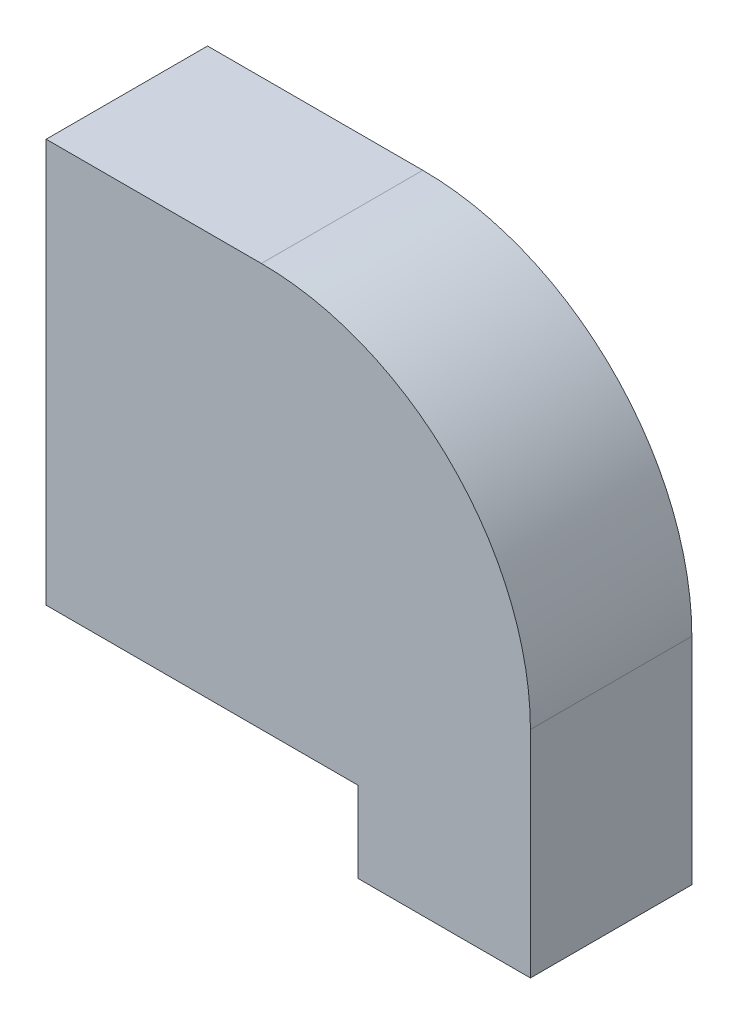
ISO-10303-21;
HEADER;
FILE_DESCRIPTION(('STEP AP214'),'2;1');
FILE_NAME('part.step','',(''),(''),'','','');
FILE_SCHEMA(('AUTOMOTIVE_DESIGN { 1 0 10303 214 1 1 1 1 }'));
ENDSEC;
DATA;
#1=APPLICATION_CONTEXT('core data for automotive mechanical design processes');
#2=APPLICATION_PROTOCOL_DEFINITION('international standard','automotive_design',2000,#1);
#3=PRODUCT_CONTEXT('',#1,'mechanical');
#4=PRODUCT('Part','Part','',(#3));
#5=PRODUCT_RELATED_PRODUCT_CATEGORY('part','',(#4));
#6=PRODUCT_DEFINITION_FORMATION('','',#4);
#7=PRODUCT_DEFINITION_CONTEXT('part definition',#1,'design');
#8=PRODUCT_DEFINITION('design','',#6,#7);
#9=PRODUCT_DEFINITION_SHAPE('','',#8);
#10=(LENGTH_UNIT() NAMED_UNIT(*) SI_UNIT(.MILLI.,.METRE.));
#11=(NAMED_UNIT(*) PLANE_ANGLE_UNIT() SI_UNIT($,.RADIAN.));
#12=(NAMED_UNIT(*) SI_UNIT($,.STERADIAN.) SOLID_ANGLE_UNIT());
#13=UNCERTAINTY_MEASURE_WITH_UNIT(LENGTH_MEASURE(1.E-05),#10,'distance_accuracy_value','');
#14=(GEOMETRIC_REPRESENTATION_CONTEXT(3) GLOBAL_UNCERTAINTY_ASSIGNED_CONTEXT((#13)) GLOBAL_UNIT_ASSIGNED_CONTEXT((#10,
#11,#12)) REPRESENTATION_CONTEXT('',''));
#15=CARTESIAN_POINT('',(0.,0.,0.));
#16=DIRECTION('',(0.,0.,1.));
#17=DIRECTION('',(1.,0.,0.));
#18=AXIS2_PLACEMENT_3D('',#15,#16,#17);
#19=CARTESIAN_POINT('',(25.4,25.4,19.05));
#20=DIRECTION('',(0.,0.,-1.));
#21=DIRECTION('',(-1.,0.,0.));
#22=AXIS2_PLACEMENT_3D('',#19,#20,#21);
#23=CYLINDRICAL_SURFACE('',#22,31.75);
#24=CARTESIAN_POINT('',(25.4,25.4,0.));
#25=DIRECTION('',(0.,0.,1.));
#26=DIRECTION('',(1.,0.,0.));
#27=AXIS2_PLACEMENT_3D('',#24,#25,#26);
#28=CIRCLE('',#27,31.75);
#29=CARTESIAN_POINT('',(25.4,57.15,0.));
#30=VERTEX_POINT('',#29);
#31=CARTESIAN_POINT('',(57.15,25.4,0.));
#32=VERTEX_POINT('',#31);
#33=EDGE_CURVE('E124',#30,#32,#28,.F.);
#34=ORIENTED_EDGE('',*,*,#33,.F.);
#35=DIRECTION('',(0.,0.,-1.));
#36=VECTOR('',#35,1.);
#37=CARTESIAN_POINT('',(25.4,57.15,19.05));
#38=LINE('',#37,#36);
#39=CARTESIAN_POINT('',(25.4,57.15,19.05));
#40=VERTEX_POINT('',#39);
#41=EDGE_CURVE('E11',#40,#30,#38,.T.);
#42=ORIENTED_EDGE('',*,*,#41,.F.);
#43=CARTESIAN_POINT('',(25.4,25.4,19.05));
#44=DIRECTION('',(0.,0.,1.));
#45=DIRECTION('',(1.,0.,0.));
#46=AXIS2_PLACEMENT_3D('',#43,#44,#45);
#47=CIRCLE('',#46,31.75);
#48=CARTESIAN_POINT('',(57.15,25.4,19.05));
#49=VERTEX_POINT('',#48);
#50=EDGE_CURVE('E139',#40,#49,#47,.F.);
#51=ORIENTED_EDGE('',*,*,#50,.T.);
#52=DIRECTION('',(0.,0.,-1.));
#53=VECTOR('',#52,1.);
#54=CARTESIAN_POINT('',(57.15,25.4,19.05));
#55=LINE('',#54,#53);
#56=EDGE_CURVE('E85',#49,#32,#55,.T.);
#57=ORIENTED_EDGE('',*,*,#56,.T.);
#58=EDGE_LOOP('',(#34,#42,#51,#57));
#59=FACE_BOUND('',#58,.T.);
#60=ADVANCED_FACE('F37',(#59),#23,.T.);
#61=CARTESIAN_POINT('',(0.,57.15,19.05));
#62=DIRECTION('',(0.,1.,0.));
#63=DIRECTION('',(-1.,0.,0.));
#64=AXIS2_PLACEMENT_3D('',#61,#62,#63);
#65=PLANE('',#64);
#66=DIRECTION('',(1.,0.,0.));
#67=VECTOR('',#66,1.);
#68=CARTESIAN_POINT('',(0.,57.15,0.));
#69=LINE('',#68,#67);
#70=CARTESIAN_POINT('',(0.,57.15,0.));
#71=VERTEX_POINT('',#70);
#72=EDGE_CURVE('E127',#71,#30,#69,.T.);
#73=ORIENTED_EDGE('',*,*,#72,.F.);
#74=DIRECTION('',(0.,0.,-1.));
#75=VECTOR('',#74,1.);
#76=CARTESIAN_POINT('',(0.,57.15,19.05));
#77=LINE('',#76,#75);
#78=CARTESIAN_POINT('',(0.,57.15,19.05));
#79=VERTEX_POINT('',#78);
#80=EDGE_CURVE('E45',#79,#71,#77,.T.);
#81=ORIENTED_EDGE('',*,*,#80,.F.);
#82=DIRECTION('',(1.,0.,0.));
#83=VECTOR('',#82,1.);
#84=CARTESIAN_POINT('',(0.,57.15,19.05));
#85=LINE('',#84,#83);
#86=EDGE_CURVE('E159',#79,#40,#85,.T.);
#87=ORIENTED_EDGE('',*,*,#86,.T.);
#88=ORIENTED_EDGE('',*,*,#41,.T.);
#89=EDGE_LOOP('',(#73,#81,#87,#88));
#90=FACE_BOUND('',#89,.T.);
#91=ADVANCED_FACE('F153',(#90),#65,.T.);
#92=CARTESIAN_POINT('',(0.,0.,19.05));
#93=DIRECTION('',(-1.,0.,0.));
#94=DIRECTION('',(0.,0.,1.));
#95=AXIS2_PLACEMENT_3D('',#92,#93,#94);
#96=PLANE('',#95);
#97=DIRECTION('',(0.,1.,0.));
#98=VECTOR('',#97,1.);
#99=CARTESIAN_POINT('',(0.,0.,0.));
#100=LINE('',#99,#98);
#101=CARTESIAN_POINT('',(0.,9.525,0.));
#102=VERTEX_POINT('',#101);
#103=EDGE_CURVE('E130',#102,#71,#100,.T.);
#104=ORIENTED_EDGE('',*,*,#103,.F.);
#105=DIRECTION('',(0.,0.,-1.));
#106=VECTOR('',#105,1.);
#107=CARTESIAN_POINT('',(0.,9.525,19.05));
#108=LINE('',#107,#106);
#109=CARTESIAN_POINT('',(0.,9.525,19.05));
#110=VERTEX_POINT('',#109);
#111=EDGE_CURVE('E143',#110,#102,#108,.T.);
#112=ORIENTED_EDGE('',*,*,#111,.F.);
#113=DIRECTION('',(0.,1.,0.));
#114=VECTOR('',#113,1.);
#115=CARTESIAN_POINT('',(0.,0.,19.05));
#116=LINE('',#115,#114);
#117=EDGE_CURVE('E149',#110,#79,#116,.T.);
#118=ORIENTED_EDGE('',*,*,#117,.T.);
#119=ORIENTED_EDGE('',*,*,#80,.T.);
#120=EDGE_LOOP('',(#104,#112,#118,#119));
#121=FACE_BOUND('',#120,.T.);
#122=ADVANCED_FACE('F148',(#121),#96,.T.);
#123=CARTESIAN_POINT('',(0.,9.525,19.05));
#124=DIRECTION('',(0.,1.,0.));
#125=DIRECTION('',(-1.,0.,0.));
#126=AXIS2_PLACEMENT_3D('',#123,#124,#125);
#127=PLANE('',#126);
#128=DIRECTION('',(1.,0.,0.));
#129=VECTOR('',#128,1.);
#130=CARTESIAN_POINT('',(0.,9.525,0.));
#131=LINE('',#130,#129);
#132=CARTESIAN_POINT('',(36.83,9.525,0.));
#133=VERTEX_POINT('',#132);
#134=EDGE_CURVE('E133',#102,#133,#131,.T.);
#135=ORIENTED_EDGE('',*,*,#134,.T.);
#136=DIRECTION('',(0.,0.,-1.));
#137=VECTOR('',#136,1.);
#138=CARTESIAN_POINT('',(36.83,9.525,19.05));
#139=LINE('',#138,#137);
#140=CARTESIAN_POINT('',(36.83,9.525,19.05));
#141=VERTEX_POINT('',#140);
#142=EDGE_CURVE('E116',#141,#133,#139,.T.);
#143=ORIENTED_EDGE('',*,*,#142,.F.);
#144=DIRECTION('',(1.,0.,0.));
#145=VECTOR('',#144,1.);
#146=CARTESIAN_POINT('',(0.,9.525,19.05));
#147=LINE('',#146,#145);
#148=EDGE_CURVE('E107',#110,#141,#147,.T.);
#149=ORIENTED_EDGE('',*,*,#148,.F.);
#150=ORIENTED_EDGE('',*,*,#111,.T.);
#151=EDGE_LOOP('',(#135,#143,#149,#150));
#152=FACE_BOUND('',#151,.T.);
#153=ADVANCED_FACE('F158',(#152),#127,.F.);
#154=CARTESIAN_POINT('',(36.83,0.,19.05));
#155=DIRECTION('',(1.,0.,0.));
#156=DIRECTION('',(0.,1.,0.));
#157=AXIS2_PLACEMENT_3D('',#154,#155,#156);
#158=PLANE('',#157);
#159=DIRECTION('',(0.,-1.,0.));
#160=VECTOR('',#159,1.);
#161=CARTESIAN_POINT('',(36.83,0.,0.));
#162=LINE('',#161,#160);
#163=CARTESIAN_POINT('',(36.83,0.,0.));
#164=VERTEX_POINT('',#163);
#165=EDGE_CURVE('E115',#133,#164,#162,.T.);
#166=ORIENTED_EDGE('',*,*,#165,.T.);
#167=DIRECTION('',(0.,0.,-1.));
#168=VECTOR('',#167,1.);
#169=CARTESIAN_POINT('',(36.83,0.,19.05));
#170=LINE('',#169,#168);
#171=CARTESIAN_POINT('',(36.83,0.,19.05));
#172=VERTEX_POINT('',#171);
#173=EDGE_CURVE('E112',#172,#164,#170,.T.);
#174=ORIENTED_EDGE('',*,*,#173,.F.);
#175=DIRECTION('',(0.,-1.,0.));
#176=VECTOR('',#175,1.);
#177=CARTESIAN_POINT('',(36.83,0.,19.05));
#178=LINE('',#177,#176);
#179=EDGE_CURVE('E100',#141,#172,#178,.T.);
#180=ORIENTED_EDGE('',*,*,#179,.F.);
#181=ORIENTED_EDGE('',*,*,#142,.T.);
#182=EDGE_LOOP('',(#166,#174,#180,#181));
#183=FACE_BOUND('',#182,.T.);
#184=ADVANCED_FACE('F113',(#183),#158,.F.);
#185=CARTESIAN_POINT('',(0.,0.,19.05));
#186=DIRECTION('',(0.,1.,0.));
#187=DIRECTION('',(0.,0.,1.));
#188=AXIS2_PLACEMENT_3D('',#185,#186,#187);
#189=PLANE('',#188);
#190=DIRECTION('',(1.,0.,0.));
#191=VECTOR('',#190,1.);
#192=CARTESIAN_POINT('',(0.,0.,0.));
#193=LINE('',#192,#191);
#194=CARTESIAN_POINT('',(57.15,0.,0.));
#195=VERTEX_POINT('',#194);
#196=EDGE_CURVE('E78',#164,#195,#193,.T.);
#197=ORIENTED_EDGE('',*,*,#196,.T.);
#198=DIRECTION('',(0.,0.,-1.));
#199=VECTOR('',#198,1.);
#200=CARTESIAN_POINT('',(57.15,0.,19.05));
#201=LINE('',#200,#199);
#202=CARTESIAN_POINT('',(57.15,0.,19.05));
#203=VERTEX_POINT('',#202);
#204=EDGE_CURVE('E117',#203,#195,#201,.T.);
#205=ORIENTED_EDGE('',*,*,#204,.F.);
#206=DIRECTION('',(1.,0.,0.));
#207=VECTOR('',#206,1.);
#208=CARTESIAN_POINT('',(0.,0.,19.05));
#209=LINE('',#208,#207);
#210=EDGE_CURVE('E104',#172,#203,#209,.T.);
#211=ORIENTED_EDGE('',*,*,#210,.F.);
#212=ORIENTED_EDGE('',*,*,#173,.T.);
#213=EDGE_LOOP('',(#197,#205,#211,#212));
#214=FACE_BOUND('',#213,.T.);
#215=ADVANCED_FACE('F119',(#214),#189,.F.);
#216=CARTESIAN_POINT('',(57.15,0.,19.05));
#217=DIRECTION('',(-1.,0.,0.));
#218=DIRECTION('',(0.,-1.,0.));
#219=AXIS2_PLACEMENT_3D('',#216,#217,#218);
#220=PLANE('',#219);
#221=DIRECTION('',(0.,1.,0.));
#222=VECTOR('',#221,1.);
#223=CARTESIAN_POINT('',(57.15,0.,0.));
#224=LINE('',#223,#222);
#225=EDGE_CURVE('E137',#195,#32,#224,.T.);
#226=ORIENTED_EDGE('',*,*,#225,.T.);
#227=ORIENTED_EDGE('',*,*,#56,.F.);
#228=DIRECTION('',(0.,1.,0.));
#229=VECTOR('',#228,1.);
#230=CARTESIAN_POINT('',(57.15,0.,19.05));
#231=LINE('',#230,#229);
#232=EDGE_CURVE('E53',#203,#49,#231,.T.);
#233=ORIENTED_EDGE('',*,*,#232,.F.);
#234=ORIENTED_EDGE('',*,*,#204,.T.);
#235=EDGE_LOOP('',(#226,#227,#233,#234));
#236=FACE_BOUND('',#235,.T.);
#237=ADVANCED_FACE('F178',(#236),#220,.F.);
#238=CARTESIAN_POINT('',(0.,0.,19.05));
#239=DIRECTION('',(0.,0.,1.));
#240=DIRECTION('',(1.,0.,0.));
#241=AXIS2_PLACEMENT_3D('',#238,#239,#240);
#242=PLANE('',#241);
#243=ORIENTED_EDGE('',*,*,#50,.F.);
#244=ORIENTED_EDGE('',*,*,#86,.F.);
#245=ORIENTED_EDGE('',*,*,#117,.F.);
#246=ORIENTED_EDGE('',*,*,#148,.T.);
#247=ORIENTED_EDGE('',*,*,#179,.T.);
#248=ORIENTED_EDGE('',*,*,#210,.T.);
#249=ORIENTED_EDGE('',*,*,#232,.T.);
#250=EDGE_LOOP('',(#243,#244,#245,#246,#247,#248,#249));
#251=FACE_BOUND('',#250,.T.);
#252=ADVANCED_FACE('F102',(#251),#242,.T.);
#253=CARTESIAN_POINT('',(0.,0.,0.));
#254=DIRECTION('',(0.,0.,1.));
#255=DIRECTION('',(1.,0.,0.));
#256=AXIS2_PLACEMENT_3D('',#253,#254,#255);
#257=PLANE('',#256);
#258=ORIENTED_EDGE('',*,*,#33,.T.);
#259=ORIENTED_EDGE('',*,*,#225,.F.);
#260=ORIENTED_EDGE('',*,*,#196,.F.);
#261=ORIENTED_EDGE('',*,*,#165,.F.);
#262=ORIENTED_EDGE('',*,*,#134,.F.);
#263=ORIENTED_EDGE('',*,*,#103,.T.);
#264=ORIENTED_EDGE('',*,*,#72,.T.);
#265=EDGE_LOOP('',(#258,#259,#260,#261,#262,#263,#264));
#266=FACE_BOUND('',#265,.T.);
#267=ADVANCED_FACE('F156',(#266),#257,.F.);
#268=CLOSED_SHELL('',(#60,#91,#122,#153,#184,#215,#237,#252,#267));
#269=MANIFOLD_SOLID_BREP('B2',#268);
#270=ADVANCED_BREP_SHAPE_REPRESENTATION('',(#18,#269),#14);
#271=SHAPE_DEFINITION_REPRESENTATION(#9,#270);
ENDSEC;
END-ISO-10303-21;
